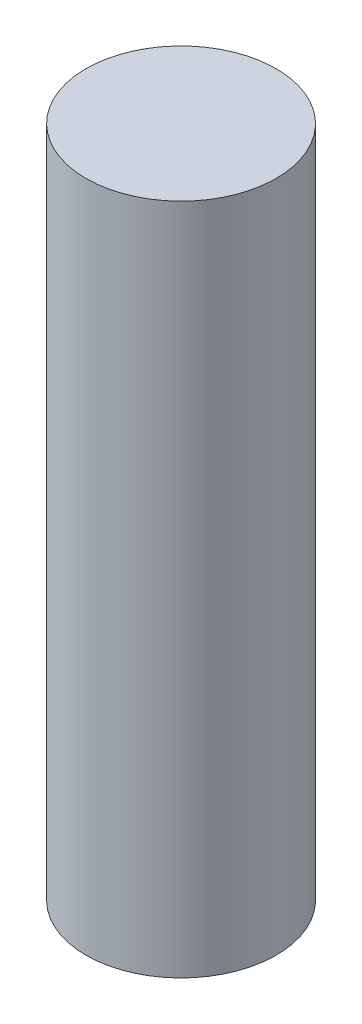
ISO-10303-21;
HEADER;
FILE_DESCRIPTION(('STEP AP214'),'2;1');
FILE_NAME('part.step','',(''),(''),'','','');
FILE_SCHEMA(('AUTOMOTIVE_DESIGN { 1 0 10303 214 1 1 1 1 }'));
ENDSEC;
DATA;
#1=APPLICATION_CONTEXT('core data for automotive mechanical design processes');
#2=APPLICATION_PROTOCOL_DEFINITION('international standard','automotive_design',2000,#1);
#3=PRODUCT_CONTEXT('',#1,'mechanical');
#4=PRODUCT('Part','Part','',(#3));
#5=PRODUCT_RELATED_PRODUCT_CATEGORY('part','',(#4));
#6=PRODUCT_DEFINITION_FORMATION('','',#4);
#7=PRODUCT_DEFINITION_CONTEXT('part definition',#1,'design');
#8=PRODUCT_DEFINITION('design','',#6,#7);
#9=PRODUCT_DEFINITION_SHAPE('','',#8);
#10=(LENGTH_UNIT() NAMED_UNIT(*) SI_UNIT(.MILLI.,.METRE.));
#11=(NAMED_UNIT(*) PLANE_ANGLE_UNIT() SI_UNIT($,.RADIAN.));
#12=(NAMED_UNIT(*) SI_UNIT($,.STERADIAN.) SOLID_ANGLE_UNIT());
#13=UNCERTAINTY_MEASURE_WITH_UNIT(LENGTH_MEASURE(1.E-05),#10,'distance_accuracy_value','');
#14=(GEOMETRIC_REPRESENTATION_CONTEXT(3) GLOBAL_UNCERTAINTY_ASSIGNED_CONTEXT((#13)) GLOBAL_UNIT_ASSIGNED_CONTEXT((#10,
#11,#12)) REPRESENTATION_CONTEXT('',''));
#15=CARTESIAN_POINT('',(0.,0.,0.));
#16=DIRECTION('',(0.,0.,1.));
#17=DIRECTION('',(1.,0.,0.));
#18=AXIS2_PLACEMENT_3D('',#15,#16,#17);
#19=CARTESIAN_POINT('',(0.,32.425,0.));
#20=DIRECTION('',(0.,-1.,0.));
#21=DIRECTION('',(0.,0.,-1.));
#22=AXIS2_PLACEMENT_3D('',#19,#20,#21);
#23=CYLINDRICAL_SURFACE('',#22,9.165);
#24=CARTESIAN_POINT('',(0.,32.425,0.));
#25=DIRECTION('',(0.,1.,0.));
#26=DIRECTION('',(0.,0.,1.));
#27=AXIS2_PLACEMENT_3D('',#24,#25,#26);
#28=CIRCLE('',#27,9.165);
#29=CARTESIAN_POINT('',(0.,32.425,9.165));
#30=VERTEX_POINT('',#29);
#31=EDGE_CURVE('E10',#30,#30,#28,.T.);
#32=ORIENTED_EDGE('',*,*,#31,.F.);
#33=EDGE_LOOP('',(#32));
#34=FACE_BOUND('',#33,.T.);
#35=CARTESIAN_POINT('',(0.,-32.425,0.));
#36=DIRECTION('',(0.,1.,0.));
#37=DIRECTION('',(0.,0.,1.));
#38=AXIS2_PLACEMENT_3D('',#35,#36,#37);
#39=CIRCLE('',#38,9.165);
#40=CARTESIAN_POINT('',(0.,-32.425,9.165));
#41=VERTEX_POINT('',#40);
#42=EDGE_CURVE('E46',#41,#41,#39,.T.);
#43=ORIENTED_EDGE('',*,*,#42,.T.);
#44=EDGE_LOOP('',(#43));
#45=FACE_BOUND('',#44,.T.);
#46=ADVANCED_FACE('F43',(#34,#45),#23,.T.);
#47=CARTESIAN_POINT('',(0.,32.425,0.));
#48=DIRECTION('',(0.,1.,0.));
#49=DIRECTION('',(0.,0.,1.));
#50=AXIS2_PLACEMENT_3D('',#47,#48,#49);
#51=PLANE('',#50);
#52=ORIENTED_EDGE('',*,*,#31,.T.);
#53=EDGE_LOOP('',(#52));
#54=FACE_BOUND('',#53,.T.);
#55=ADVANCED_FACE('F60',(#54),#51,.T.);
#56=CARTESIAN_POINT('',(0.,-32.425,0.));
#57=DIRECTION('',(0.,1.,0.));
#58=DIRECTION('',(0.,0.,1.));
#59=AXIS2_PLACEMENT_3D('',#56,#57,#58);
#60=PLANE('',#59);
#61=ORIENTED_EDGE('',*,*,#42,.F.);
#62=EDGE_LOOP('',(#61));
#63=FACE_BOUND('',#62,.T.);
#64=ADVANCED_FACE('F58',(#63),#60,.F.);
#65=CLOSED_SHELL('',(#46,#55,#64));
#66=MANIFOLD_SOLID_BREP('B2',#65);
#67=ADVANCED_BREP_SHAPE_REPRESENTATION('',(#18,#66),#14);
#68=SHAPE_DEFINITION_REPRESENTATION(#9,#67);
ENDSEC;
END-ISO-10303-21;
